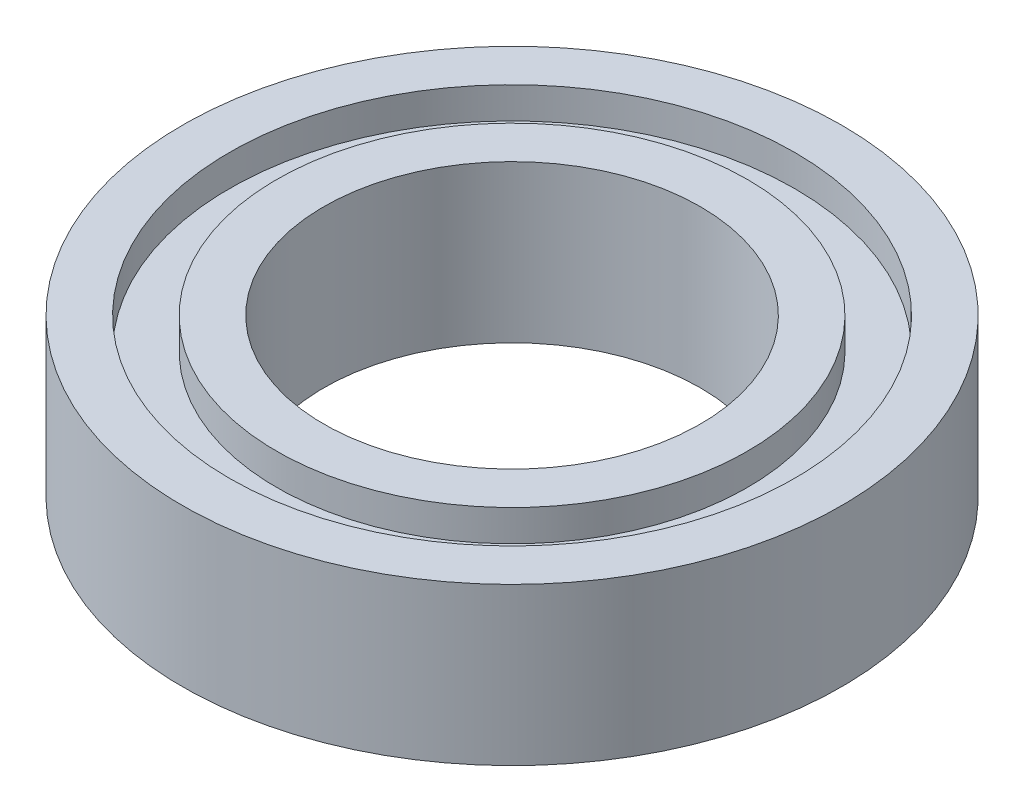
ISO-10303-21;
HEADER;
FILE_DESCRIPTION(('STEP AP214'),'2;1');
FILE_NAME('part.step','',(''),(''),'','','');
FILE_SCHEMA(('AUTOMOTIVE_DESIGN { 1 0 10303 214 1 1 1 1 }'));
ENDSEC;
DATA;
#1=APPLICATION_CONTEXT('core data for automotive mechanical design processes');
#2=APPLICATION_PROTOCOL_DEFINITION('international standard','automotive_design',2000,#1);
#3=PRODUCT_CONTEXT('',#1,'mechanical');
#4=PRODUCT('Part','Part','',(#3));
#5=PRODUCT_RELATED_PRODUCT_CATEGORY('part','',(#4));
#6=PRODUCT_DEFINITION_FORMATION('','',#4);
#7=PRODUCT_DEFINITION_CONTEXT('part definition',#1,'design');
#8=PRODUCT_DEFINITION('design','',#6,#7);
#9=PRODUCT_DEFINITION_SHAPE('','',#8);
#10=(LENGTH_UNIT() NAMED_UNIT(*) SI_UNIT(.MILLI.,.METRE.));
#11=(NAMED_UNIT(*) PLANE_ANGLE_UNIT() SI_UNIT($,.RADIAN.));
#12=(NAMED_UNIT(*) SI_UNIT($,.STERADIAN.) SOLID_ANGLE_UNIT());
#13=UNCERTAINTY_MEASURE_WITH_UNIT(LENGTH_MEASURE(1.E-05),#10,'distance_accuracy_value','');
#14=(GEOMETRIC_REPRESENTATION_CONTEXT(3) GLOBAL_UNCERTAINTY_ASSIGNED_CONTEXT((#13)) GLOBAL_UNIT_ASSIGNED_CONTEXT((#10,
#11,#12)) REPRESENTATION_CONTEXT('',''));
#15=CARTESIAN_POINT('',(0.,0.,0.));
#16=DIRECTION('',(0.,0.,1.));
#17=DIRECTION('',(1.,0.,0.));
#18=AXIS2_PLACEMENT_3D('',#15,#16,#17);
#19=CARTESIAN_POINT('',(-7.5,6.85670535698484,0.));
#20=DIRECTION('',(0.,1.,0.));
#21=DIRECTION('',(0.,0.,1.));
#22=AXIS2_PLACEMENT_3D('',#19,#20,#21);
#23=PLANE('',#22);
#24=CARTESIAN_POINT('',(0.,6.85670535698484,0.));
#25=DIRECTION('',(0.,-1.,0.));
#26=DIRECTION('',(0.,0.,-1.));
#27=AXIS2_PLACEMENT_3D('',#24,#25,#26);
#28=CIRCLE('',#27,6.);
#29=CARTESIAN_POINT('',(0.,6.85670535698484,-6.));
#30=VERTEX_POINT('',#29);
#31=EDGE_CURVE('E10',#30,#30,#28,.T.);
#32=ORIENTED_EDGE('',*,*,#31,.F.);
#33=EDGE_LOOP('',(#32));
#34=FACE_BOUND('',#33,.T.);
#35=CARTESIAN_POINT('',(0.,6.85670535698484,0.));
#36=DIRECTION('',(0.,-1.,0.));
#37=DIRECTION('',(0.,0.,-1.));
#38=AXIS2_PLACEMENT_3D('',#35,#36,#37);
#39=CIRCLE('',#38,7.5);
#40=CARTESIAN_POINT('',(0.,6.85670535698484,-7.5));
#41=VERTEX_POINT('',#40);
#42=EDGE_CURVE('E72',#41,#41,#39,.T.);
#43=ORIENTED_EDGE('',*,*,#42,.T.);
#44=EDGE_LOOP('',(#43));
#45=FACE_BOUND('',#44,.T.);
#46=ADVANCED_FACE('F32',(#34,#45),#23,.F.);
#47=CARTESIAN_POINT('',(0.,0.,0.));
#48=DIRECTION('',(0.,-1.,0.));
#49=DIRECTION('',(0.,0.,-1.));
#50=AXIS2_PLACEMENT_3D('',#47,#48,#49);
#51=CYLINDRICAL_SURFACE('',#50,6.);
#52=CARTESIAN_POINT('',(0.,11.8567053569848,0.));
#53=DIRECTION('',(0.,-1.,0.));
#54=DIRECTION('',(0.,0.,-1.));
#55=AXIS2_PLACEMENT_3D('',#52,#53,#54);
#56=CIRCLE('',#55,6.);
#57=CARTESIAN_POINT('',(0.,11.8567053569848,-6.));
#58=VERTEX_POINT('',#57);
#59=EDGE_CURVE('E38',#58,#58,#56,.T.);
#60=ORIENTED_EDGE('',*,*,#59,.F.);
#61=EDGE_LOOP('',(#60));
#62=FACE_BOUND('',#61,.T.);
#63=ORIENTED_EDGE('',*,*,#31,.T.);
#64=EDGE_LOOP('',(#63));
#65=FACE_BOUND('',#64,.T.);
#66=ADVANCED_FACE('F133',(#62,#65),#51,.F.);
#67=CARTESIAN_POINT('',(-6.,11.8567053569848,0.));
#68=DIRECTION('',(0.,-1.,0.));
#69=DIRECTION('',(0.,0.,-1.));
#70=AXIS2_PLACEMENT_3D('',#67,#68,#69);
#71=PLANE('',#70);
#72=CARTESIAN_POINT('',(0.,11.8567053569848,0.));
#73=DIRECTION('',(0.,-1.,0.));
#74=DIRECTION('',(0.,0.,-1.));
#75=AXIS2_PLACEMENT_3D('',#72,#73,#74);
#76=CIRCLE('',#75,7.5);
#77=CARTESIAN_POINT('',(0.,11.8567053569848,-7.5));
#78=VERTEX_POINT('',#77);
#79=EDGE_CURVE('E42',#78,#78,#76,.T.);
#80=ORIENTED_EDGE('',*,*,#79,.F.);
#81=EDGE_LOOP('',(#80));
#82=FACE_BOUND('',#81,.T.);
#83=ORIENTED_EDGE('',*,*,#59,.T.);
#84=EDGE_LOOP('',(#83));
#85=FACE_BOUND('',#84,.T.);
#86=ADVANCED_FACE('F128',(#82,#85),#71,.F.);
#87=CARTESIAN_POINT('',(0.,0.,0.));
#88=DIRECTION('',(0.,-1.,0.));
#89=DIRECTION('',(0.,0.,-1.));
#90=AXIS2_PLACEMENT_3D('',#87,#88,#89);
#91=CYLINDRICAL_SURFACE('',#90,7.5);
#92=CARTESIAN_POINT('',(0.,10.8567053569848,0.));
#93=DIRECTION('',(0.,-1.,0.));
#94=DIRECTION('',(0.,0.,-1.));
#95=AXIS2_PLACEMENT_3D('',#92,#93,#94);
#96=CIRCLE('',#95,7.5);
#97=CARTESIAN_POINT('',(0.,10.8567053569848,-7.5));
#98=VERTEX_POINT('',#97);
#99=EDGE_CURVE('E46',#98,#98,#96,.T.);
#100=ORIENTED_EDGE('',*,*,#99,.F.);
#101=EDGE_LOOP('',(#100));
#102=FACE_BOUND('',#101,.T.);
#103=ORIENTED_EDGE('',*,*,#79,.T.);
#104=EDGE_LOOP('',(#103));
#105=FACE_BOUND('',#104,.T.);
#106=ADVANCED_FACE('F122',(#102,#105),#91,.T.);
#107=CARTESIAN_POINT('',(-7.5,10.8567053569848,0.));
#108=DIRECTION('',(0.,-1.,0.));
#109=DIRECTION('',(0.,0.,-1.));
#110=AXIS2_PLACEMENT_3D('',#107,#108,#109);
#111=PLANE('',#110);
#112=CARTESIAN_POINT('',(0.,10.8567053569848,0.));
#113=DIRECTION('',(0.,-1.,0.));
#114=DIRECTION('',(0.,0.,-1.));
#115=AXIS2_PLACEMENT_3D('',#112,#113,#114);
#116=CIRCLE('',#115,9.);
#117=CARTESIAN_POINT('',(0.,10.8567053569848,-9.));
#118=VERTEX_POINT('',#117);
#119=EDGE_CURVE('E51',#118,#118,#116,.T.);
#120=ORIENTED_EDGE('',*,*,#119,.F.);
#121=EDGE_LOOP('',(#120));
#122=FACE_BOUND('',#121,.T.);
#123=ORIENTED_EDGE('',*,*,#99,.T.);
#124=EDGE_LOOP('',(#123));
#125=FACE_BOUND('',#124,.T.);
#126=ADVANCED_FACE('F116',(#122,#125),#111,.F.);
#127=CARTESIAN_POINT('',(0.,0.,0.));
#128=DIRECTION('',(0.,-1.,0.));
#129=DIRECTION('',(0.,0.,-1.));
#130=AXIS2_PLACEMENT_3D('',#127,#128,#129);
#131=CYLINDRICAL_SURFACE('',#130,9.);
#132=CARTESIAN_POINT('',(0.,11.8567053569848,0.));
#133=DIRECTION('',(0.,-1.,0.));
#134=DIRECTION('',(0.,0.,-1.));
#135=AXIS2_PLACEMENT_3D('',#132,#133,#134);
#136=CIRCLE('',#135,9.00000000000001);
#137=CARTESIAN_POINT('',(0.,11.8567053569848,-9.00000000000001));
#138=VERTEX_POINT('',#137);
#139=EDGE_CURVE('E54',#138,#138,#136,.T.);
#140=ORIENTED_EDGE('',*,*,#139,.F.);
#141=EDGE_LOOP('',(#140));
#142=FACE_BOUND('',#141,.T.);
#143=ORIENTED_EDGE('',*,*,#119,.T.);
#144=EDGE_LOOP('',(#143));
#145=FACE_BOUND('',#144,.T.);
#146=ADVANCED_FACE('F110',(#142,#145),#131,.F.);
#147=CARTESIAN_POINT('',(-9.00000000000001,11.8567053569848,0.));
#148=DIRECTION('',(0.,-1.,0.));
#149=DIRECTION('',(0.,0.,-1.));
#150=AXIS2_PLACEMENT_3D('',#147,#148,#149);
#151=PLANE('',#150);
#152=CARTESIAN_POINT('',(0.,11.8567053569848,0.));
#153=DIRECTION('',(0.,-1.,0.));
#154=DIRECTION('',(0.,0.,-1.));
#155=AXIS2_PLACEMENT_3D('',#152,#153,#154);
#156=CIRCLE('',#155,10.5);
#157=CARTESIAN_POINT('',(0.,11.8567053569848,-10.5));
#158=VERTEX_POINT('',#157);
#159=EDGE_CURVE('E57',#158,#158,#156,.T.);
#160=ORIENTED_EDGE('',*,*,#159,.F.);
#161=EDGE_LOOP('',(#160));
#162=FACE_BOUND('',#161,.T.);
#163=ORIENTED_EDGE('',*,*,#139,.T.);
#164=EDGE_LOOP('',(#163));
#165=FACE_BOUND('',#164,.T.);
#166=ADVANCED_FACE('F104',(#162,#165),#151,.F.);
#167=CARTESIAN_POINT('',(0.,0.,0.));
#168=DIRECTION('',(0.,-1.,0.));
#169=DIRECTION('',(0.,0.,-1.));
#170=AXIS2_PLACEMENT_3D('',#167,#168,#169);
#171=CYLINDRICAL_SURFACE('',#170,10.5);
#172=CARTESIAN_POINT('',(0.,6.85670535698484,0.));
#173=DIRECTION('',(0.,-1.,0.));
#174=DIRECTION('',(0.,0.,-1.));
#175=AXIS2_PLACEMENT_3D('',#172,#173,#174);
#176=CIRCLE('',#175,10.5);
#177=CARTESIAN_POINT('',(0.,6.85670535698484,-10.5));
#178=VERTEX_POINT('',#177);
#179=EDGE_CURVE('E60',#178,#178,#176,.T.);
#180=ORIENTED_EDGE('',*,*,#179,.F.);
#181=EDGE_LOOP('',(#180));
#182=FACE_BOUND('',#181,.T.);
#183=ORIENTED_EDGE('',*,*,#159,.T.);
#184=EDGE_LOOP('',(#183));
#185=FACE_BOUND('',#184,.T.);
#186=ADVANCED_FACE('F98',(#182,#185),#171,.T.);
#187=CARTESIAN_POINT('',(-10.5,6.85670535698484,0.));
#188=DIRECTION('',(0.,1.,0.));
#189=DIRECTION('',(0.,0.,1.));
#190=AXIS2_PLACEMENT_3D('',#187,#188,#189);
#191=PLANE('',#190);
#192=CARTESIAN_POINT('',(0.,6.85670535698484,0.));
#193=DIRECTION('',(0.,-1.,0.));
#194=DIRECTION('',(0.,0.,-1.));
#195=AXIS2_PLACEMENT_3D('',#192,#193,#194);
#196=CIRCLE('',#195,9.00000000000001);
#197=CARTESIAN_POINT('',(0.,6.85670535698484,-9.00000000000001));
#198=VERTEX_POINT('',#197);
#199=EDGE_CURVE('E63',#198,#198,#196,.T.);
#200=ORIENTED_EDGE('',*,*,#199,.F.);
#201=EDGE_LOOP('',(#200));
#202=FACE_BOUND('',#201,.T.);
#203=ORIENTED_EDGE('',*,*,#179,.T.);
#204=EDGE_LOOP('',(#203));
#205=FACE_BOUND('',#204,.T.);
#206=ADVANCED_FACE('F92',(#202,#205),#191,.F.);
#207=CARTESIAN_POINT('',(0.,0.,0.));
#208=DIRECTION('',(0.,-1.,0.));
#209=DIRECTION('',(0.,0.,-1.));
#210=AXIS2_PLACEMENT_3D('',#207,#208,#209);
#211=CYLINDRICAL_SURFACE('',#210,9.00000000000001);
#212=CARTESIAN_POINT('',(0.,7.85670535698484,0.));
#213=DIRECTION('',(0.,-1.,0.));
#214=DIRECTION('',(0.,0.,-1.));
#215=AXIS2_PLACEMENT_3D('',#212,#213,#214);
#216=CIRCLE('',#215,9.00000000000001);
#217=CARTESIAN_POINT('',(0.,7.85670535698484,-9.00000000000001));
#218=VERTEX_POINT('',#217);
#219=EDGE_CURVE('E66',#218,#218,#216,.T.);
#220=ORIENTED_EDGE('',*,*,#219,.F.);
#221=EDGE_LOOP('',(#220));
#222=FACE_BOUND('',#221,.T.);
#223=ORIENTED_EDGE('',*,*,#199,.T.);
#224=EDGE_LOOP('',(#223));
#225=FACE_BOUND('',#224,.T.);
#226=ADVANCED_FACE('F86',(#222,#225),#211,.F.);
#227=CARTESIAN_POINT('',(-9.00000000000001,7.85670535698484,0.));
#228=DIRECTION('',(0.,1.,0.));
#229=DIRECTION('',(0.,0.,1.));
#230=AXIS2_PLACEMENT_3D('',#227,#228,#229);
#231=PLANE('',#230);
#232=CARTESIAN_POINT('',(0.,7.85670535698484,0.));
#233=DIRECTION('',(0.,-1.,0.));
#234=DIRECTION('',(0.,0.,-1.));
#235=AXIS2_PLACEMENT_3D('',#232,#233,#234);
#236=CIRCLE('',#235,7.5);
#237=CARTESIAN_POINT('',(0.,7.85670535698484,-7.5));
#238=VERTEX_POINT('',#237);
#239=EDGE_CURVE('E69',#238,#238,#236,.T.);
#240=ORIENTED_EDGE('',*,*,#239,.F.);
#241=EDGE_LOOP('',(#240));
#242=FACE_BOUND('',#241,.T.);
#243=ORIENTED_EDGE('',*,*,#219,.T.);
#244=EDGE_LOOP('',(#243));
#245=FACE_BOUND('',#244,.T.);
#246=ADVANCED_FACE('F80',(#242,#245),#231,.F.);
#247=CARTESIAN_POINT('',(0.,0.,0.));
#248=DIRECTION('',(0.,-1.,0.));
#249=DIRECTION('',(0.,0.,-1.));
#250=AXIS2_PLACEMENT_3D('',#247,#248,#249);
#251=CYLINDRICAL_SURFACE('',#250,7.5);
#252=ORIENTED_EDGE('',*,*,#42,.F.);
#253=EDGE_LOOP('',(#252));
#254=FACE_BOUND('',#253,.T.);
#255=ORIENTED_EDGE('',*,*,#239,.T.);
#256=EDGE_LOOP('',(#255));
#257=FACE_BOUND('',#256,.T.);
#258=ADVANCED_FACE('F77',(#254,#257),#251,.T.);
#259=CLOSED_SHELL('',(#46,#66,#86,#106,#126,#146,#166,#186,#206,#226,#246,#258));
#260=MANIFOLD_SOLID_BREP('B2',#259);
#261=ADVANCED_BREP_SHAPE_REPRESENTATION('',(#18,#260),#14);
#262=SHAPE_DEFINITION_REPRESENTATION(#9,#261);
ENDSEC;
END-ISO-10303-21;
